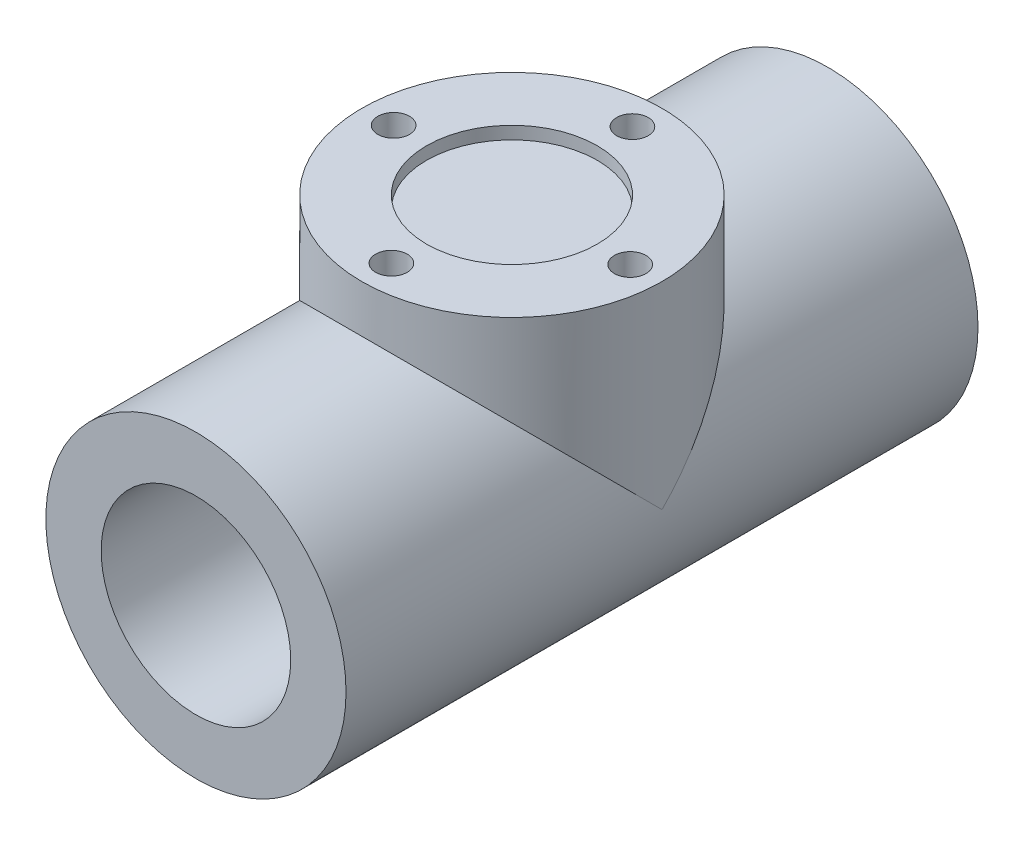
ISO-10303-21;
HEADER;
FILE_DESCRIPTION(('STEP AP214'),'2;1');
FILE_NAME('part.step','',(''),(''),'','','');
FILE_SCHEMA(('AUTOMOTIVE_DESIGN { 1 0 10303 214 1 1 1 1 }'));
ENDSEC;
DATA;
#1=APPLICATION_CONTEXT('core data for automotive mechanical design processes');
#2=APPLICATION_PROTOCOL_DEFINITION('international standard','automotive_design',2000,#1);
#3=PRODUCT_CONTEXT('',#1,'mechanical');
#4=PRODUCT('Part','Part','',(#3));
#5=PRODUCT_RELATED_PRODUCT_CATEGORY('part','',(#4));
#6=PRODUCT_DEFINITION_FORMATION('','',#4);
#7=PRODUCT_DEFINITION_CONTEXT('part definition',#1,'design');
#8=PRODUCT_DEFINITION('design','',#6,#7);
#9=PRODUCT_DEFINITION_SHAPE('','',#8);
#10=(LENGTH_UNIT() NAMED_UNIT(*) SI_UNIT(.MILLI.,.METRE.));
#11=(NAMED_UNIT(*) PLANE_ANGLE_UNIT() SI_UNIT($,.RADIAN.));
#12=(NAMED_UNIT(*) SI_UNIT($,.STERADIAN.) SOLID_ANGLE_UNIT());
#13=UNCERTAINTY_MEASURE_WITH_UNIT(LENGTH_MEASURE(1.E-05),#10,'distance_accuracy_value','');
#14=(GEOMETRIC_REPRESENTATION_CONTEXT(3) GLOBAL_UNCERTAINTY_ASSIGNED_CONTEXT((#13)) GLOBAL_UNIT_ASSIGNED_CONTEXT((#10,
#11,#12)) REPRESENTATION_CONTEXT('',''));
#15=CARTESIAN_POINT('',(0.,0.,0.));
#16=DIRECTION('',(0.,0.,1.));
#17=DIRECTION('',(1.,0.,0.));
#18=AXIS2_PLACEMENT_3D('',#15,#16,#17);
#19=CARTESIAN_POINT('',(0.,0.,200.));
#20=DIRECTION('',(0.,0.,-1.));
#21=DIRECTION('',(-1.,0.,0.));
#22=AXIS2_PLACEMENT_3D('',#19,#20,#21);
#23=CYLINDRICAL_SURFACE('',#22,30.);
#24=CARTESIAN_POINT('',(0.,0.,200.));
#25=DIRECTION('',(0.,0.,1.));
#26=DIRECTION('',(1.,0.,0.));
#27=AXIS2_PLACEMENT_3D('',#24,#25,#26);
#28=CIRCLE('',#27,30.);
#29=CARTESIAN_POINT('',(30.,0.,200.));
#30=VERTEX_POINT('',#29);
#31=EDGE_CURVE('E153',#30,#30,#28,.T.);
#32=ORIENTED_EDGE('',*,*,#31,.T.);
#33=EDGE_LOOP('',(#32));
#34=FACE_BOUND('',#33,.T.);
#35=CARTESIAN_POINT('',(0.,0.,0.));
#36=DIRECTION('',(0.,0.,1.));
#37=DIRECTION('',(1.,0.,0.));
#38=AXIS2_PLACEMENT_3D('',#35,#36,#37);
#39=CIRCLE('',#38,30.);
#40=CARTESIAN_POINT('',(30.,0.,0.));
#41=VERTEX_POINT('',#40);
#42=EDGE_CURVE('E152',#41,#41,#39,.T.);
#43=ORIENTED_EDGE('',*,*,#42,.F.);
#44=EDGE_LOOP('',(#43));
#45=FACE_BOUND('',#44,.T.);
#46=CARTESIAN_POINT('',(30.,0.,136.827299656641));
#47=CARTESIAN_POINT('',(30.0000119505361,0.374455924265691,136.827276029075));
#48=CARTESIAN_POINT('',(29.9929894167792,0.748902100394205,136.833010223074));
#49=CARTESIAN_POINT('',(29.9649658109249,1.49689507312636,136.855819357609));
#50=CARTESIAN_POINT('',(29.9439658929776,1.87044194143254,136.872893361785));
#51=CARTESIAN_POINT('',(29.8881089002417,2.61540536332435,136.918182156073));
#52=CARTESIAN_POINT('',(29.8532672133826,2.98682381949722,136.946384574464));
#53=CARTESIAN_POINT('',(29.7699080744974,3.72711456215319,137.013584115402));
#54=CARTESIAN_POINT('',(29.7213904358608,4.09598681382258,137.052581385247));
#55=CARTESIAN_POINT('',(29.5566159927085,5.19112822135676,137.18435762617));
#56=CARTESIAN_POINT('',(29.4206191807646,5.91274032343116,137.292349912456));
#57=CARTESIAN_POINT('',(29.0979075091868,7.33799679821433,137.544686599687));
#58=CARTESIAN_POINT('',(28.9111805261577,8.0416368319639,137.689039689462));
#59=CARTESIAN_POINT('',(28.4904911173969,9.42398948803503,138.008041460177));
#60=CARTESIAN_POINT('',(28.2567396693865,10.1027979870203,138.18255435147));
#61=CARTESIAN_POINT('',(27.7440369659352,11.4358420870042,138.556699074271));
#62=CARTESIAN_POINT('',(27.4650874649834,12.090078640618,138.756329930687));
#63=CARTESIAN_POINT('',(26.86359496142,13.3735084742009,139.175654942823));
#64=CARTESIAN_POINT('',(26.540950253745,14.0026387565932,139.395395507038));
#65=CARTESIAN_POINT('',(25.8545969732942,15.2327273399785,139.849204503207));
#66=CARTESIAN_POINT('',(25.4908833795592,15.8336821835885,140.083274685453));
#67=CARTESIAN_POINT('',(24.6718939671222,17.0859909275428,140.593236972872));
#68=CARTESIAN_POINT('',(24.2108947361945,17.7330564517407,140.870482198939));
#69=CARTESIAN_POINT('',(23.2402962883946,18.987298535083,141.43009173811));
#70=CARTESIAN_POINT('',(22.7306940617067,19.594472619951,141.712456367363));
#71=CARTESIAN_POINT('',(21.6645628570134,20.7671572176634,142.276002144136));
#72=CARTESIAN_POINT('',(21.1080182596204,21.332653744701,142.557182864795));
#73=CARTESIAN_POINT('',(19.9498904695977,22.4194676985832,143.112229008975));
#74=CARTESIAN_POINT('',(19.3483046382384,22.940782533234,143.386094002629));
#75=CARTESIAN_POINT('',(18.0241854662883,23.9986128959329,143.954069056992));
#76=CARTESIAN_POINT('',(17.2959236765199,24.5289214411833,144.246446719452));
#77=CARTESIAN_POINT('',(15.7878592025743,25.5256818476078,144.80670207612));
#78=CARTESIAN_POINT('',(15.0080511401328,25.9921270297263,145.074577206796));
#79=CARTESIAN_POINT('',(13.401643029492,26.8556664697754,145.577997371648));
#80=CARTESIAN_POINT('',(12.5750758510792,27.2528086621023,145.813564727619));
#81=CARTESIAN_POINT('',(10.8802727084725,27.9726078063249,146.245365442879));
#82=CARTESIAN_POINT('',(10.0120445642789,28.2952786713603,146.441606148482));
#83=CARTESIAN_POINT('',(8.33263759957857,28.8316136771908,146.770417082643));
#84=CARTESIAN_POINT('',(7.52483065638796,29.0530951330129,146.907470466239));
#85=CARTESIAN_POINT('',(5.88786992749363,29.4285213210366,147.140918478425));
#86=CARTESIAN_POINT('',(5.0587174795159,29.5824702746549,147.237315648396));
#87=CARTESIAN_POINT('',(3.38726959672531,29.8200995590151,147.386493738263));
#88=CARTESIAN_POINT('',(2.54498669049383,29.9038431420466,147.439313918636));
#89=CARTESIAN_POINT('',(0.854775674508134,29.9997595536206,147.499832991023));
#90=CARTESIAN_POINT('',(0.0068482478698574,30.011940890665,147.507537247164));
#91=CARTESIAN_POINT('',(-1.56993735853998,29.967806832471,147.479672869905));
#92=CARTESIAN_POINT('',(-2.29917704515809,29.9206561848193,147.449893913052));
#93=CARTESIAN_POINT('',(-3.75013027960727,29.7736138996731,147.357309826574));
#94=CARTESIAN_POINT('',(-4.47184468255744,29.673728322692,147.294508492018));
#95=CARTESIAN_POINT('',(-5.90276085397428,29.4225284118384,147.137305850752));
#96=CARTESIAN_POINT('',(-6.61196207422511,29.2712118305751,147.042903163154));
#97=CARTESIAN_POINT('',(-8.01329208136874,28.9190102079168,146.824566925747));
#98=CARTESIAN_POINT('',(-8.7054201440962,28.718123067928,146.700632125689));
#99=CARTESIAN_POINT('',(-10.0696600980455,28.2686856101297,146.425606729266));
#100=CARTESIAN_POINT('',(-10.7417392936795,28.0200618807157,146.274474329888));
#101=CARTESIAN_POINT('',(-12.0614034704886,27.4778360981808,145.948172997522));
#102=CARTESIAN_POINT('',(-12.7089887703546,27.1842346305181,145.773004377407));
#103=CARTESIAN_POINT('',(-13.9769674841142,26.5545757283601,145.401881083379));
#104=CARTESIAN_POINT('',(-14.5973599950385,26.2185168854528,145.205925719955));
#105=CARTESIAN_POINT('',(-15.8087606951708,25.5064077117228,144.796673267987));
#106=CARTESIAN_POINT('',(-16.3997670008732,25.1303548223224,144.583375070158));
#107=CARTESIAN_POINT('',(-17.622863641624,24.2909793727877,144.115365416145));
#108=CARTESIAN_POINT('',(-18.2508026951947,23.8226273183818,143.858815963748));
#109=CARTESIAN_POINT('',(-19.4651764963998,22.8411157123451,143.333528388463));
#110=CARTESIAN_POINT('',(-20.0516083129604,22.3279530020705,143.064789406993));
#111=CARTESIAN_POINT('',(-21.1822130640733,21.2584207459874,142.520092293833));
#112=CARTESIAN_POINT('',(-21.7263099638251,20.7019768927212,142.24412231116));
#113=CARTESIAN_POINT('',(-22.7694566767168,19.5488212494165,141.691131015948));
#114=CARTESIAN_POINT('',(-23.2685039670573,18.9521072074946,141.414109645436));
#115=CARTESIAN_POINT('',(-24.2843395271615,17.6366645386531,140.827805387426));
#116=CARTESIAN_POINT('',(-24.794355320084,16.912363404257,140.519242255829));
#117=CARTESIAN_POINT('',(-25.7510679070926,15.4165739552301,139.918063708826));
#118=CARTESIAN_POINT('',(-26.1977542651443,14.6450778932801,139.62545092675));
#119=CARTESIAN_POINT('',(-27.0225206625752,13.0605595681603,139.067638601213));
#120=CARTESIAN_POINT('',(-27.4008420676808,12.2476969217762,138.802344095776));
#121=CARTESIAN_POINT('',(-28.0863044115177,10.5815951391151,138.309111444472));
#122=CARTESIAN_POINT('',(-28.3934665050023,9.72836809372553,138.081162202252));
#123=CARTESIAN_POINT('',(-28.8793612528174,8.15610478024933,137.713478063024));
#124=CARTESIAN_POINT('',(-29.0714499320864,7.44317034522344,137.565208710387));
#125=CARTESIAN_POINT('',(-29.4034787699013,5.99865668177356,137.305898621345));
#126=CARTESIAN_POINT('',(-29.5434396612361,5.26708498990389,137.194843085651));
#127=CARTESIAN_POINT('',(-29.713059747541,4.15647971060946,137.059266140165));
#128=CARTESIAN_POINT('',(-29.7630163610921,3.78229830500615,137.019128350749));
#129=CARTESIAN_POINT('',(-29.8488548571779,3.0312771043472,136.949951742714));
#130=CARTESIAN_POINT('',(-29.8847369756738,2.65443735396698,136.920912738022));
#131=CARTESIAN_POINT('',(-29.9422720585262,1.89847272477693,136.874269965205));
#132=CARTESIAN_POINT('',(-29.9639063133731,1.51934549844233,136.856681233294));
#133=CARTESIAN_POINT('',(-29.992777255665,0.760149059359157,136.833183032188));
#134=CARTESIAN_POINT('',(-30.0000126501137,0.380079765082345,136.827274611867));
#135=CARTESIAN_POINT('',(-30.,0.,136.827299656641));
#136=B_SPLINE_CURVE_WITH_KNOTS('',3,(#46,#47,#48,#49,#50,#51,#52,#53,#54,#55,#56,#57,#58,#59,
#60,#61,#62,#63,#64,#65,#66,#67,#68,#69,#70,#71,#72,#73,#74,#75,#76,#77,#78,#79,#80,#81,#82,#83,
#84,#85,#86,#87,#88,#89,#90,#91,#92,#93,#94,#95,#96,#97,#98,#99,#100,#101,#102,#103,#104,#105,
#106,#107,#108,#109,#110,#111,#112,#113,#114,#115,#116,#117,#118,#119,#120,#121,#122,#123,#124,
#125,#126,#127,#128,#129,#130,#131,#132,#133,#134,#135),.UNSPECIFIED.,.F.,.F.,(4,2,2,2,2,2,2,2,
2,2,2,2,2,2,2,2,2,2,2,2,2,2,2,2,2,2,2,2,2,2,2,2,2,2,2,2,2,2,2,2,2,2,2,2,4),(0.,1.12324121172139,
2.24638968590683,3.36829303150502,4.49021168638553,6.71357456931195,8.93746925515808,
11.1516003377524,13.365645493232,15.5849355942859,17.8044973134888,20.3264563881367,
22.8485717405344,25.3715296257338,27.8946354336298,30.7322849868108,33.5702310850615,
36.4062064296769,39.2416515122412,41.7841880382191,44.3265656090967,46.8666501281253,
49.4064326338383,51.5979013854583,53.7891183393496,55.9804310556004,58.1718365580634,
60.36663949888,62.5614138732057,64.7562610725337,66.9512487694982,69.4216834795099,
71.8922924679781,74.3672409563012,76.8423279570346,79.653078665542,82.4642920196055,
85.2653776094674,88.0656294007364,90.3223083198244,92.5780887289252,93.7166198438439,
94.855131870285,95.9951359627342,97.1352424212329),.UNSPECIFIED.);
#137=CARTESIAN_POINT('',(30.,0.,136.827299656641));
#138=VERTEX_POINT('',#137);
#139=CARTESIAN_POINT('',(-30.,0.,136.827299656641));
#140=VERTEX_POINT('',#139);
#141=EDGE_CURVE('E54',#138,#140,#136,.T.);
#142=ORIENTED_EDGE('',*,*,#141,.F.);
#143=DIRECTION('',(0.,0.,-1.));
#144=VECTOR('',#143,1.);
#145=CARTESIAN_POINT('',(30.,0.,200.));
#146=LINE('',#145,#144);
#147=CARTESIAN_POINT('',(30.,0.,63.1727003433594));
#148=VERTEX_POINT('',#147);
#149=EDGE_CURVE('E11',#138,#148,#146,.T.);
#150=ORIENTED_EDGE('',*,*,#149,.T.);
#151=CARTESIAN_POINT('',(-30.,0.,63.1727003433594));
#152=CARTESIAN_POINT('',(-30.0000119505361,0.374455924265691,63.1727239709255));
#153=CARTESIAN_POINT('',(-29.9929894167792,0.748902100394204,63.1669897769261));
#154=CARTESIAN_POINT('',(-29.9649658109249,1.49689507312636,63.1441806423915));
#155=CARTESIAN_POINT('',(-29.9439658929776,1.87044194143253,63.127106638215));
#156=CARTESIAN_POINT('',(-29.8881089002417,2.61540536332435,63.0818178439268));
#157=CARTESIAN_POINT('',(-29.8532672133827,2.98682381949721,63.0536154255357));
#158=CARTESIAN_POINT('',(-29.7699080744974,3.72711456215319,62.9864158845975));
#159=CARTESIAN_POINT('',(-29.7213904358608,4.09598681382257,62.9474186147532));
#160=CARTESIAN_POINT('',(-29.5566159927085,5.19112822135676,62.81564237383));
#161=CARTESIAN_POINT('',(-29.4206191807646,5.91274032343116,62.7076500875437));
#162=CARTESIAN_POINT('',(-29.0979075091868,7.33799679821433,62.4553134003132));
#163=CARTESIAN_POINT('',(-28.9111805261577,8.0416368319639,62.3109603105382));
#164=CARTESIAN_POINT('',(-28.4904911173969,9.42398948803503,61.9919585398234));
#165=CARTESIAN_POINT('',(-28.2567396693865,10.1027979870203,61.8174456485302));
#166=CARTESIAN_POINT('',(-27.7440369659352,11.4358420870042,61.4433009257291));
#167=CARTESIAN_POINT('',(-27.4650874649834,12.090078640618,61.2436700693126));
#168=CARTESIAN_POINT('',(-26.86359496142,13.3735084742009,60.8243450571767));
#169=CARTESIAN_POINT('',(-26.540950253745,14.0026387565932,60.6046044929619));
#170=CARTESIAN_POINT('',(-25.8545969732942,15.2327273399785,60.1507954967927));
#171=CARTESIAN_POINT('',(-25.4908833795592,15.8336821835885,59.916725314547));
#172=CARTESIAN_POINT('',(-24.6718939671222,17.0859909275428,59.406763027128));
#173=CARTESIAN_POINT('',(-24.2108947361945,17.7330564517407,59.1295178010611));
#174=CARTESIAN_POINT('',(-23.2402962883946,18.987298535083,58.5699082618901));
#175=CARTESIAN_POINT('',(-22.7306940617067,19.594472619951,58.287543632637));
#176=CARTESIAN_POINT('',(-21.6645628570134,20.7671572176634,57.7239978558637));
#177=CARTESIAN_POINT('',(-21.1080182596204,21.332653744701,57.4428171352053));
#178=CARTESIAN_POINT('',(-19.9498904695977,22.4194676985832,56.8877709910252));
#179=CARTESIAN_POINT('',(-19.3483046382384,22.940782533234,56.6139059973708));
#180=CARTESIAN_POINT('',(-18.0241854662883,23.9986128959329,56.0459309430083));
#181=CARTESIAN_POINT('',(-17.2959236765199,24.5289214411833,55.7535532805479));
#182=CARTESIAN_POINT('',(-15.7878592025743,25.5256818476078,55.1932979238796));
#183=CARTESIAN_POINT('',(-15.0080511401328,25.9921270297263,54.9254227932037));
#184=CARTESIAN_POINT('',(-13.401643029492,26.8556664697754,54.4220026283525));
#185=CARTESIAN_POINT('',(-12.5750758510792,27.2528086621023,54.1864352723807));
#186=CARTESIAN_POINT('',(-10.8802727084725,27.9726078063249,53.7546345571213));
#187=CARTESIAN_POINT('',(-10.0120445642789,28.2952786713603,53.558393851518));
#188=CARTESIAN_POINT('',(-8.33263759957857,28.8316136771908,53.2295829173573));
#189=CARTESIAN_POINT('',(-7.52483065638795,29.0530951330129,53.0925295337614));
#190=CARTESIAN_POINT('',(-5.88786992749362,29.4285213210366,52.8590815215752));
#191=CARTESIAN_POINT('',(-5.05871747951589,29.5824702746549,52.7626843516037));
#192=CARTESIAN_POINT('',(-3.38726959672531,29.8200995590151,52.6135062617366));
#193=CARTESIAN_POINT('',(-2.54498669049382,29.9038431420466,52.5606860813638));
#194=CARTESIAN_POINT('',(-0.854775674508129,29.9997595536206,52.5001670089766));
#195=CARTESIAN_POINT('',(-0.00684824786985382,30.011940890665,52.4924627528364));
#196=CARTESIAN_POINT('',(1.56993735853998,29.967806832471,52.520327130095));
#197=CARTESIAN_POINT('',(2.29917704515809,29.9206561848193,52.5501060869479));
#198=CARTESIAN_POINT('',(3.75013027960727,29.7736138996731,52.6426901734265));
#199=CARTESIAN_POINT('',(4.47184468255744,29.673728322692,52.7054915079824));
#200=CARTESIAN_POINT('',(5.90276085397429,29.4225284118384,52.8626941492481));
#201=CARTESIAN_POINT('',(6.61196207422512,29.2712118305751,52.9570968368459));
#202=CARTESIAN_POINT('',(8.01329208136875,28.9190102079168,53.1754330742529));
#203=CARTESIAN_POINT('',(8.7054201440962,28.718123067928,53.2993678743109));
#204=CARTESIAN_POINT('',(10.0696600980455,28.2686856101297,53.5743932707337));
#205=CARTESIAN_POINT('',(10.7417392936795,28.0200618807157,53.7255256701119));
#206=CARTESIAN_POINT('',(12.0614034704887,27.4778360981808,54.0518270024784));
#207=CARTESIAN_POINT('',(12.7089887703547,27.1842346305181,54.2269956225932));
#208=CARTESIAN_POINT('',(13.9769674841142,26.5545757283601,54.5981189166208));
#209=CARTESIAN_POINT('',(14.5973599950385,26.2185168854528,54.7940742800446));
#210=CARTESIAN_POINT('',(15.8087606951709,25.5064077117228,55.2033267320133));
#211=CARTESIAN_POINT('',(16.3997670008732,25.1303548223224,55.4166249298423));
#212=CARTESIAN_POINT('',(17.622863641624,24.2909793727877,55.8846345838553));
#213=CARTESIAN_POINT('',(18.2508026951947,23.8226273183818,56.1411840362523));
#214=CARTESIAN_POINT('',(19.4651764963998,22.8411157123451,56.6664716115374));
#215=CARTESIAN_POINT('',(20.0516083129604,22.3279530020705,56.9352105930068));
#216=CARTESIAN_POINT('',(21.1822130640733,21.2584207459874,57.4799077061673));
#217=CARTESIAN_POINT('',(21.7263099638251,20.7019768927212,57.7558776888404));
#218=CARTESIAN_POINT('',(22.7694566767168,19.5488212494165,58.3088689840517));
#219=CARTESIAN_POINT('',(23.2685039670573,18.9521072074946,58.585890354564));
#220=CARTESIAN_POINT('',(24.2843395271615,17.6366645386531,59.1721946125744));
#221=CARTESIAN_POINT('',(24.794355320084,16.912363404257,59.4807577441707));
#222=CARTESIAN_POINT('',(25.7510679070926,15.4165739552301,60.081936291174));
#223=CARTESIAN_POINT('',(26.1977542651443,14.6450778932801,60.3745490732499));
#224=CARTESIAN_POINT('',(27.0225206625752,13.0605595681603,60.9323613987875));
#225=CARTESIAN_POINT('',(27.4008420676808,12.2476969217762,61.197655904224));
#226=CARTESIAN_POINT('',(28.0863044115177,10.5815951391151,61.6908885555279));
#227=CARTESIAN_POINT('',(28.3934665050023,9.72836809372553,61.9188377977482));
#228=CARTESIAN_POINT('',(28.8793612528174,8.15610478024933,62.2865219369759));
#229=CARTESIAN_POINT('',(29.0714499320864,7.44317034522344,62.4347912896127));
#230=CARTESIAN_POINT('',(29.4034787699013,5.99865668177356,62.6941013786554));
#231=CARTESIAN_POINT('',(29.5434396612361,5.26708498990389,62.8051569143489));
#232=CARTESIAN_POINT('',(29.713059747541,4.15647971060946,62.9407338598349));
#233=CARTESIAN_POINT('',(29.7630163610921,3.78229830500615,62.9808716492508));
#234=CARTESIAN_POINT('',(29.8488548571779,3.0312771043472,63.0500482572858));
#235=CARTESIAN_POINT('',(29.8847369756738,2.65443735396698,63.0790872619776));
#236=CARTESIAN_POINT('',(29.9422720585262,1.89847272477694,63.1257300347948));
#237=CARTESIAN_POINT('',(29.9639063133731,1.51934549844234,63.1433187667058));
#238=CARTESIAN_POINT('',(29.992777255665,0.760149059359169,63.1668169678125));
#239=CARTESIAN_POINT('',(30.0000126501137,0.380079765082353,63.1727253881334));
#240=CARTESIAN_POINT('',(30.,0.,63.1727003433594));
#241=B_SPLINE_CURVE_WITH_KNOTS('',3,(#151,#152,#153,#154,#155,#156,#157,#158,#159,#160,#161,
#162,#163,#164,#165,#166,#167,#168,#169,#170,#171,#172,#173,#174,#175,#176,#177,#178,#179,#180,
#181,#182,#183,#184,#185,#186,#187,#188,#189,#190,#191,#192,#193,#194,#195,#196,#197,#198,#199,
#200,#201,#202,#203,#204,#205,#206,#207,#208,#209,#210,#211,#212,#213,#214,#215,#216,#217,#218,
#219,#220,#221,#222,#223,#224,#225,#226,#227,#228,#229,#230,#231,#232,#233,#234,#235,#236,#237,
#238,#239,#240),.UNSPECIFIED.,.F.,.F.,(4,2,2,2,2,2,2,2,2,2,2,2,2,2,2,2,2,2,2,2,2,2,2,2,2,2,2,2,
2,2,2,2,2,2,2,2,2,2,2,2,2,2,2,2,4),(0.,1.12324121172139,2.24638968590682,3.36829303150502,
4.49021168638552,6.71357456931194,8.93746925515808,11.1516003377524,13.365645493232,
15.5849355942859,17.8044973134888,20.3264563881367,22.8485717405344,25.3715296257338,
27.8946354336298,30.7322849868108,33.5702310850615,36.4062064296769,39.2416515122412,
41.7841880382191,44.3265656090967,46.8666501281253,49.4064326338383,51.5979013854583,
53.7891183393496,55.9804310556004,58.1718365580634,60.36663949888,62.5614138732057,
64.7562610725337,66.9512487694982,69.4216834795099,71.8922924679781,74.3672409563012,
76.8423279570346,79.6530786655421,82.4642920196055,85.2653776094674,88.0656294007364,
90.3223083198244,92.5780887289253,93.7166198438439,94.855131870285,95.9951359627342,
97.1352424212329),.UNSPECIFIED.);
#242=CARTESIAN_POINT('',(-30.,0.,63.1727003433594));
#243=VERTEX_POINT('',#242);
#244=EDGE_CURVE('E172',#243,#148,#241,.T.);
#245=ORIENTED_EDGE('',*,*,#244,.F.);
#246=DIRECTION('',(0.,0.,-1.));
#247=VECTOR('',#246,1.);
#248=CARTESIAN_POINT('',(-30.,0.,200.));
#249=LINE('',#248,#247);
#250=EDGE_CURVE('E165',#243,#140,#249,.F.);
#251=ORIENTED_EDGE('',*,*,#250,.T.);
#252=EDGE_LOOP('',(#142,#150,#245,#251));
#253=FACE_BOUND('',#252,.T.);
#254=ADVANCED_FACE('F45',(#34,#45,#253),#23,.F.);
#255=CARTESIAN_POINT('',(0.,0.,200.));
#256=DIRECTION('',(0.,0.,1.));
#257=DIRECTION('',(1.,0.,0.));
#258=AXIS2_PLACEMENT_3D('',#255,#256,#257);
#259=PLANE('',#258);
#260=CARTESIAN_POINT('',(0.,0.,200.));
#261=DIRECTION('',(0.,0.,1.));
#262=DIRECTION('',(1.,0.,0.));
#263=AXIS2_PLACEMENT_3D('',#260,#261,#262);
#264=CIRCLE('',#263,47.5);
#265=CARTESIAN_POINT('',(47.5,0.,200.));
#266=VERTEX_POINT('',#265);
#267=EDGE_CURVE('E161',#266,#266,#264,.T.);
#268=ORIENTED_EDGE('',*,*,#267,.T.);
#269=EDGE_LOOP('',(#268));
#270=FACE_BOUND('',#269,.T.);
#271=ORIENTED_EDGE('',*,*,#31,.F.);
#272=EDGE_LOOP('',(#271));
#273=FACE_BOUND('',#272,.T.);
#274=ADVANCED_FACE('F237',(#270,#273),#259,.T.);
#275=CARTESIAN_POINT('',(0.,0.,0.));
#276=DIRECTION('',(0.,0.,1.));
#277=DIRECTION('',(1.,0.,0.));
#278=AXIS2_PLACEMENT_3D('',#275,#276,#277);
#279=PLANE('',#278);
#280=CARTESIAN_POINT('',(0.,0.,0.));
#281=DIRECTION('',(0.,0.,1.));
#282=DIRECTION('',(1.,0.,0.));
#283=AXIS2_PLACEMENT_3D('',#280,#281,#282);
#284=CIRCLE('',#283,47.5);
#285=CARTESIAN_POINT('',(47.5,0.,0.));
#286=VERTEX_POINT('',#285);
#287=EDGE_CURVE('E157',#286,#286,#284,.T.);
#288=ORIENTED_EDGE('',*,*,#287,.F.);
#289=EDGE_LOOP('',(#288));
#290=FACE_BOUND('',#289,.T.);
#291=ORIENTED_EDGE('',*,*,#42,.T.);
#292=EDGE_LOOP('',(#291));
#293=FACE_BOUND('',#292,.T.);
#294=ADVANCED_FACE('F244',(#290,#293),#279,.F.);
#295=CARTESIAN_POINT('',(0.,0.,200.));
#296=DIRECTION('',(0.,0.,-1.));
#297=DIRECTION('',(-1.,0.,0.));
#298=AXIS2_PLACEMENT_3D('',#295,#296,#297);
#299=CYLINDRICAL_SURFACE('',#298,47.5);
#300=CARTESIAN_POINT('',(0.,0.,100.));
#301=DIRECTION('',(0.,-0.707106781186547,-0.707106781186547));
#302=DIRECTION('',(0.,0.707106781186547,-0.707106781186547));
#303=AXIS2_PLACEMENT_3D('',#300,#301,#302);
#304=ELLIPSE('',#303,67.175144212722,47.5);
#305=CARTESIAN_POINT('',(-47.5,0.,100.));
#306=VERTEX_POINT('',#305);
#307=CARTESIAN_POINT('',(47.5,0.,100.));
#308=VERTEX_POINT('',#307);
#309=EDGE_CURVE('E147',#306,#308,#304,.T.);
#310=ORIENTED_EDGE('',*,*,#309,.T.);
#311=CARTESIAN_POINT('',(0.,0.,100.));
#312=DIRECTION('',(0.,0.707106781186547,-0.707106781186547));
#313=DIRECTION('',(0.,-0.707106781186547,-0.707106781186547));
#314=AXIS2_PLACEMENT_3D('',#311,#312,#313);
#315=ELLIPSE('',#314,67.175144212722,47.5);
#316=EDGE_CURVE('E60',#308,#306,#315,.F.);
#317=ORIENTED_EDGE('',*,*,#316,.T.);
#318=EDGE_LOOP('',(#310,#317));
#319=FACE_BOUND('',#318,.T.);
#320=ORIENTED_EDGE('',*,*,#267,.F.);
#321=EDGE_LOOP('',(#320));
#322=FACE_BOUND('',#321,.T.);
#323=ORIENTED_EDGE('',*,*,#287,.T.);
#324=EDGE_LOOP('',(#323));
#325=FACE_BOUND('',#324,.T.);
#326=ADVANCED_FACE('F47',(#319,#322,#325),#299,.T.);
#327=CARTESIAN_POINT('',(0.,0.,100.));
#328=DIRECTION('',(0.,1.,0.));
#329=DIRECTION('',(0.,0.,1.));
#330=AXIS2_PLACEMENT_3D('',#327,#328,#329);
#331=PLANE('',#330);
#332=ORIENTED_EDGE('',*,*,#149,.F.);
#333=CARTESIAN_POINT('',(0.,0.,100.));
#334=DIRECTION('',(0.,1.,0.));
#335=DIRECTION('',(0.,0.,1.));
#336=AXIS2_PLACEMENT_3D('',#333,#334,#335);
#337=CIRCLE('',#336,47.5);
#338=EDGE_CURVE('E68',#140,#138,#337,.T.);
#339=ORIENTED_EDGE('',*,*,#338,.F.);
#340=ORIENTED_EDGE('',*,*,#250,.F.);
#341=EDGE_CURVE('E143',#148,#243,#337,.T.);
#342=ORIENTED_EDGE('',*,*,#341,.F.);
#343=EDGE_LOOP('',(#332,#339,#340,#342));
#344=FACE_BOUND('',#343,.T.);
#345=ADVANCED_FACE('F191',(#344),#331,.F.);
#346=CARTESIAN_POINT('',(0.,0.,100.));
#347=DIRECTION('',(0.,1.,0.));
#348=DIRECTION('',(0.,0.,1.));
#349=AXIS2_PLACEMENT_3D('',#346,#347,#348);
#350=CYLINDRICAL_SURFACE('',#349,47.5);
#351=ORIENTED_EDGE('',*,*,#341,.T.);
#352=ORIENTED_EDGE('',*,*,#244,.T.);
#353=EDGE_LOOP('',(#351,#352));
#354=FACE_BOUND('',#353,.T.);
#355=ADVANCED_FACE('F186',(#354),#350,.T.);
#356=ORIENTED_EDGE('',*,*,#338,.T.);
#357=ORIENTED_EDGE('',*,*,#141,.T.);
#358=EDGE_LOOP('',(#356,#357));
#359=FACE_BOUND('',#358,.T.);
#360=ADVANCED_FACE('F190',(#359),#350,.T.);
#361=CARTESIAN_POINT('',(0.,62.5,100.));
#362=DIRECTION('',(0.,1.,0.));
#363=DIRECTION('',(0.,0.,1.));
#364=AXIS2_PLACEMENT_3D('',#361,#362,#363);
#365=CIRCLE('',#364,47.5);
#366=CARTESIAN_POINT('',(0.,62.5,147.5));
#367=VERTEX_POINT('',#366);
#368=EDGE_CURVE('E137',#367,#367,#365,.T.);
#369=ORIENTED_EDGE('',*,*,#368,.F.);
#370=EDGE_LOOP('',(#369));
#371=FACE_BOUND('',#370,.T.);
#372=ORIENTED_EDGE('',*,*,#316,.F.);
#373=ORIENTED_EDGE('',*,*,#309,.F.);
#374=EDGE_LOOP('',(#372,#373));
#375=FACE_BOUND('',#374,.T.);
#376=ADVANCED_FACE('F193',(#371,#375),#350,.T.);
#377=CARTESIAN_POINT('',(0.,62.5,100.));
#378=DIRECTION('',(0.,1.,0.));
#379=DIRECTION('',(0.,0.,1.));
#380=AXIS2_PLACEMENT_3D('',#377,#378,#379);
#381=PLANE('',#380);
#382=CARTESIAN_POINT('',(37.7872603083771,62.5,100.350654227049));
#383=DIRECTION('',(0.,1.,0.));
#384=DIRECTION('',(0.,0.,1.));
#385=AXIS2_PLACEMENT_3D('',#382,#383,#384);
#386=CIRCLE('',#385,4.99999999999999);
#387=CARTESIAN_POINT('',(37.7872603083771,62.5,105.350654227049));
#388=VERTEX_POINT('',#387);
#389=EDGE_CURVE('E103',#388,#388,#386,.T.);
#390=ORIENTED_EDGE('',*,*,#389,.F.);
#391=EDGE_LOOP('',(#390));
#392=FACE_BOUND('',#391,.T.);
#393=CARTESIAN_POINT('',(-0.350654227049357,62.5,137.787260308377));
#394=DIRECTION('',(0.,1.,0.));
#395=DIRECTION('',(0.,0.,1.));
#396=AXIS2_PLACEMENT_3D('',#393,#394,#395);
#397=CIRCLE('',#396,4.99999999999999);
#398=CARTESIAN_POINT('',(-0.350654227049357,62.5,142.787260308377));
#399=VERTEX_POINT('',#398);
#400=EDGE_CURVE('E102',#399,#399,#397,.T.);
#401=ORIENTED_EDGE('',*,*,#400,.F.);
#402=EDGE_LOOP('',(#401));
#403=FACE_BOUND('',#402,.T.);
#404=CARTESIAN_POINT('',(-37.7872603083771,62.5,99.6493457729508));
#405=DIRECTION('',(0.,1.,0.));
#406=DIRECTION('',(0.,0.,1.));
#407=AXIS2_PLACEMENT_3D('',#404,#405,#406);
#408=CIRCLE('',#407,4.99999999999999);
#409=CARTESIAN_POINT('',(-37.7872603083771,62.5,104.649345772951));
#410=VERTEX_POINT('',#409);
#411=EDGE_CURVE('E116',#410,#410,#408,.T.);
#412=ORIENTED_EDGE('',*,*,#411,.F.);
#413=EDGE_LOOP('',(#412));
#414=FACE_BOUND('',#413,.T.);
#415=CARTESIAN_POINT('',(0.350654227049357,62.5,62.2127396916229));
#416=DIRECTION('',(0.,1.,0.));
#417=DIRECTION('',(0.,0.,1.));
#418=AXIS2_PLACEMENT_3D('',#415,#416,#417);
#419=CIRCLE('',#418,4.99999999999999);
#420=CARTESIAN_POINT('',(0.350654227049357,62.5,67.2127396916229));
#421=VERTEX_POINT('',#420);
#422=EDGE_CURVE('E124',#421,#421,#419,.T.);
#423=ORIENTED_EDGE('',*,*,#422,.F.);
#424=EDGE_LOOP('',(#423));
#425=FACE_BOUND('',#424,.T.);
#426=CARTESIAN_POINT('',(0.,62.5,100.));
#427=DIRECTION('',(0.,1.,0.));
#428=DIRECTION('',(0.,0.,1.));
#429=AXIS2_PLACEMENT_3D('',#426,#427,#428);
#430=CIRCLE('',#429,27.);
#431=CARTESIAN_POINT('',(0.,62.5,127.));
#432=VERTEX_POINT('',#431);
#433=EDGE_CURVE('E132',#432,#432,#430,.T.);
#434=ORIENTED_EDGE('',*,*,#433,.F.);
#435=EDGE_LOOP('',(#434));
#436=FACE_BOUND('',#435,.T.);
#437=ORIENTED_EDGE('',*,*,#368,.T.);
#438=EDGE_LOOP('',(#437));
#439=FACE_BOUND('',#438,.T.);
#440=ADVANCED_FACE('F194',(#392,#403,#414,#425,#436,#439),#381,.T.);
#441=CARTESIAN_POINT('',(0.,58.5,100.));
#442=DIRECTION('',(0.,1.,0.));
#443=DIRECTION('',(0.,0.,1.));
#444=AXIS2_PLACEMENT_3D('',#441,#442,#443);
#445=CYLINDRICAL_SURFACE('',#444,27.);
#446=CARTESIAN_POINT('',(0.,58.5,100.));
#447=DIRECTION('',(0.,1.,0.));
#448=DIRECTION('',(0.,0.,1.));
#449=AXIS2_PLACEMENT_3D('',#446,#447,#448);
#450=CIRCLE('',#449,27.);
#451=CARTESIAN_POINT('',(0.,58.5,127.));
#452=VERTEX_POINT('',#451);
#453=EDGE_CURVE('E133',#452,#452,#450,.T.);
#454=ORIENTED_EDGE('',*,*,#453,.F.);
#455=EDGE_LOOP('',(#454));
#456=FACE_BOUND('',#455,.T.);
#457=ORIENTED_EDGE('',*,*,#433,.T.);
#458=EDGE_LOOP('',(#457));
#459=FACE_BOUND('',#458,.T.);
#460=ADVANCED_FACE('F198',(#456,#459),#445,.F.);
#461=CARTESIAN_POINT('',(0.,58.5,100.));
#462=DIRECTION('',(0.,1.,0.));
#463=DIRECTION('',(0.,0.,1.));
#464=AXIS2_PLACEMENT_3D('',#461,#462,#463);
#465=PLANE('',#464);
#466=ORIENTED_EDGE('',*,*,#453,.T.);
#467=EDGE_LOOP('',(#466));
#468=FACE_BOUND('',#467,.T.);
#469=ADVANCED_FACE('F204',(#468),#465,.T.);
#470=CARTESIAN_POINT('',(0.350654227049357,42.5,62.2127396916229));
#471=DIRECTION('',(0.,1.,0.));
#472=DIRECTION('',(0.,0.,1.));
#473=AXIS2_PLACEMENT_3D('',#470,#471,#472);
#474=CONICAL_SURFACE('',#473,4.99999999999999,1.02974425867665);
#475=CARTESIAN_POINT('',(0.350654227049352,39.4956969048622,62.2127396916229));
#476=VERTEX_POINT('',#475);
#477=VERTEX_LOOP('',#476);
#478=FACE_BOUND('',#477,.T.);
#479=CARTESIAN_POINT('',(0.350654227049357,42.5,62.2127396916229));
#480=DIRECTION('',(0.,1.,0.));
#481=DIRECTION('',(0.,0.,1.));
#482=AXIS2_PLACEMENT_3D('',#479,#480,#481);
#483=CIRCLE('',#482,4.99999999999999);
#484=CARTESIAN_POINT('',(0.350654227049357,42.5,67.2127396916229));
#485=VERTEX_POINT('',#484);
#486=EDGE_CURVE('E128',#485,#485,#483,.T.);
#487=ORIENTED_EDGE('',*,*,#486,.T.);
#488=EDGE_LOOP('',(#487));
#489=FACE_BOUND('',#488,.T.);
#490=ADVANCED_FACE('F208',(#478,#489),#474,.F.);
#491=CARTESIAN_POINT('',(0.350654227049357,62.5,62.2127396916229));
#492=DIRECTION('',(0.,1.,0.));
#493=DIRECTION('',(0.,0.,1.));
#494=AXIS2_PLACEMENT_3D('',#491,#492,#493);
#495=CYLINDRICAL_SURFACE('',#494,4.99999999999999);
#496=ORIENTED_EDGE('',*,*,#486,.F.);
#497=EDGE_LOOP('',(#496));
#498=FACE_BOUND('',#497,.T.);
#499=ORIENTED_EDGE('',*,*,#422,.T.);
#500=EDGE_LOOP('',(#499));
#501=FACE_BOUND('',#500,.T.);
#502=ADVANCED_FACE('F212',(#498,#501),#495,.F.);
#503=CARTESIAN_POINT('',(-37.7872603083771,42.5,99.6493457729508));
#504=DIRECTION('',(0.,1.,0.));
#505=DIRECTION('',(0.,0.,1.));
#506=AXIS2_PLACEMENT_3D('',#503,#504,#505);
#507=CONICAL_SURFACE('',#506,4.99999999999998,1.02974425867665);
#508=CARTESIAN_POINT('',(-37.7872603083771,39.4956969048622,99.6493457729508));
#509=VERTEX_POINT('',#508);
#510=VERTEX_LOOP('',#509);
#511=FACE_BOUND('',#510,.T.);
#512=CARTESIAN_POINT('',(-37.7872603083771,42.5,99.6493457729508));
#513=DIRECTION('',(0.,1.,0.));
#514=DIRECTION('',(0.,0.,1.));
#515=AXIS2_PLACEMENT_3D('',#512,#513,#514);
#516=CIRCLE('',#515,4.99999999999998);
#517=CARTESIAN_POINT('',(-37.7872603083771,42.5,104.649345772951));
#518=VERTEX_POINT('',#517);
#519=EDGE_CURVE('E120',#518,#518,#516,.T.);
#520=ORIENTED_EDGE('',*,*,#519,.T.);
#521=EDGE_LOOP('',(#520));
#522=FACE_BOUND('',#521,.T.);
#523=ADVANCED_FACE('F216',(#511,#522),#507,.F.);
#524=CARTESIAN_POINT('',(-37.7872603083771,62.5,99.6493457729508));
#525=DIRECTION('',(0.,1.,0.));
#526=DIRECTION('',(0.,0.,1.));
#527=AXIS2_PLACEMENT_3D('',#524,#525,#526);
#528=CYLINDRICAL_SURFACE('',#527,4.99999999999999);
#529=ORIENTED_EDGE('',*,*,#519,.F.);
#530=EDGE_LOOP('',(#529));
#531=FACE_BOUND('',#530,.T.);
#532=ORIENTED_EDGE('',*,*,#411,.T.);
#533=EDGE_LOOP('',(#532));
#534=FACE_BOUND('',#533,.T.);
#535=ADVANCED_FACE('F220',(#531,#534),#528,.F.);
#536=CARTESIAN_POINT('',(-0.350654227049357,42.5,137.787260308377));
#537=DIRECTION('',(0.,1.,0.));
#538=DIRECTION('',(0.,0.,1.));
#539=AXIS2_PLACEMENT_3D('',#536,#537,#538);
#540=CONICAL_SURFACE('',#539,4.99999999999999,1.02974425867665);
#541=CARTESIAN_POINT('',(-0.350654227049363,39.4956969048622,137.787260308377));
#542=VERTEX_POINT('',#541);
#543=VERTEX_LOOP('',#542);
#544=FACE_BOUND('',#543,.T.);
#545=CARTESIAN_POINT('',(-0.350654227049357,42.5,137.787260308377));
#546=DIRECTION('',(0.,1.,0.));
#547=DIRECTION('',(0.,0.,1.));
#548=AXIS2_PLACEMENT_3D('',#545,#546,#547);
#549=CIRCLE('',#548,4.99999999999999);
#550=CARTESIAN_POINT('',(-0.350654227049357,42.5,142.787260308377));
#551=VERTEX_POINT('',#550);
#552=EDGE_CURVE('E108',#551,#551,#549,.T.);
#553=ORIENTED_EDGE('',*,*,#552,.T.);
#554=EDGE_LOOP('',(#553));
#555=FACE_BOUND('',#554,.T.);
#556=ADVANCED_FACE('F224',(#544,#555),#540,.F.);
#557=CARTESIAN_POINT('',(-0.350654227049357,62.5,137.787260308377));
#558=DIRECTION('',(0.,1.,0.));
#559=DIRECTION('',(0.,0.,1.));
#560=AXIS2_PLACEMENT_3D('',#557,#558,#559);
#561=CYLINDRICAL_SURFACE('',#560,4.99999999999999);
#562=ORIENTED_EDGE('',*,*,#552,.F.);
#563=EDGE_LOOP('',(#562));
#564=FACE_BOUND('',#563,.T.);
#565=ORIENTED_EDGE('',*,*,#400,.T.);
#566=EDGE_LOOP('',(#565));
#567=FACE_BOUND('',#566,.T.);
#568=ADVANCED_FACE('F95',(#564,#567),#561,.F.);
#569=CARTESIAN_POINT('',(37.7872603083771,42.5,100.350654227049));
#570=DIRECTION('',(0.,1.,0.));
#571=DIRECTION('',(0.,0.,1.));
#572=AXIS2_PLACEMENT_3D('',#569,#570,#571);
#573=CONICAL_SURFACE('',#572,4.99999999999998,1.02974425867665);
#574=CARTESIAN_POINT('',(37.7872603083771,39.4956969048622,100.350654227049));
#575=VERTEX_POINT('',#574);
#576=VERTEX_LOOP('',#575);
#577=FACE_BOUND('',#576,.T.);
#578=CARTESIAN_POINT('',(37.7872603083771,42.5,100.350654227049));
#579=DIRECTION('',(0.,1.,0.));
#580=DIRECTION('',(0.,0.,1.));
#581=AXIS2_PLACEMENT_3D('',#578,#579,#580);
#582=CIRCLE('',#581,4.99999999999998);
#583=CARTESIAN_POINT('',(37.7872603083771,42.5,105.350654227049));
#584=VERTEX_POINT('',#583);
#585=EDGE_CURVE('E99',#584,#584,#582,.T.);
#586=ORIENTED_EDGE('',*,*,#585,.T.);
#587=EDGE_LOOP('',(#586));
#588=FACE_BOUND('',#587,.T.);
#589=ADVANCED_FACE('F91',(#577,#588),#573,.F.);
#590=CARTESIAN_POINT('',(37.7872603083771,62.5,100.350654227049));
#591=DIRECTION('',(0.,1.,0.));
#592=DIRECTION('',(0.,0.,1.));
#593=AXIS2_PLACEMENT_3D('',#590,#591,#592);
#594=CYLINDRICAL_SURFACE('',#593,4.99999999999999);
#595=ORIENTED_EDGE('',*,*,#585,.F.);
#596=EDGE_LOOP('',(#595));
#597=FACE_BOUND('',#596,.T.);
#598=ORIENTED_EDGE('',*,*,#389,.T.);
#599=EDGE_LOOP('',(#598));
#600=FACE_BOUND('',#599,.T.);
#601=ADVANCED_FACE('F94',(#597,#600),#594,.F.);
#602=CLOSED_SHELL('',(#254,#274,#294,#326,#345,#355,#360,#376,#440,#460,#469,#490,#502,#523,
#535,#556,#568,#589,#601));
#603=MANIFOLD_SOLID_BREP('B2',#602);
#604=ADVANCED_BREP_SHAPE_REPRESENTATION('',(#18,#603),#14);
#605=SHAPE_DEFINITION_REPRESENTATION(#9,#604);
ENDSEC;
END-ISO-10303-21;
